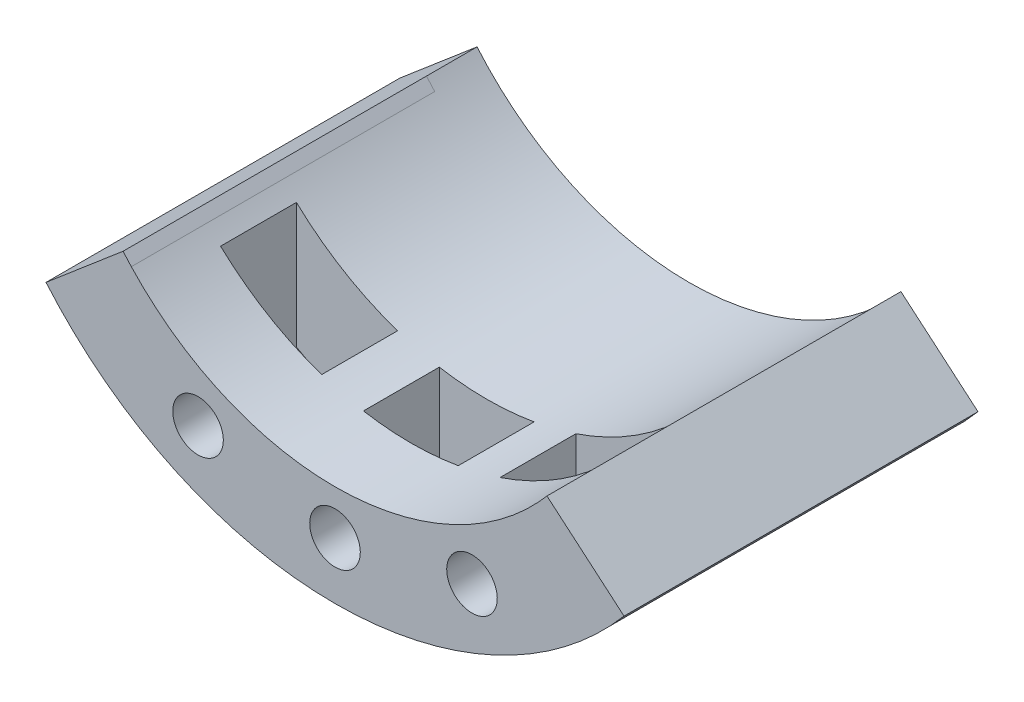
ISO-10303-21;
HEADER;
FILE_DESCRIPTION(('STEP AP214'),'2;1');
FILE_NAME('part.step','',(''),(''),'','','');
FILE_SCHEMA(('AUTOMOTIVE_DESIGN { 1 0 10303 214 1 1 1 1 }'));
ENDSEC;
DATA;
#1=APPLICATION_CONTEXT('core data for automotive mechanical design processes');
#2=APPLICATION_PROTOCOL_DEFINITION('international standard','automotive_design',2000,#1);
#3=PRODUCT_CONTEXT('',#1,'mechanical');
#4=PRODUCT('Part','Part','',(#3));
#5=PRODUCT_RELATED_PRODUCT_CATEGORY('part','',(#4));
#6=PRODUCT_DEFINITION_FORMATION('','',#4);
#7=PRODUCT_DEFINITION_CONTEXT('part definition',#1,'design');
#8=PRODUCT_DEFINITION('design','',#6,#7);
#9=PRODUCT_DEFINITION_SHAPE('','',#8);
#10=(LENGTH_UNIT() NAMED_UNIT(*) SI_UNIT(.MILLI.,.METRE.));
#11=(NAMED_UNIT(*) PLANE_ANGLE_UNIT() SI_UNIT($,.RADIAN.));
#12=(NAMED_UNIT(*) SI_UNIT($,.STERADIAN.) SOLID_ANGLE_UNIT());
#13=UNCERTAINTY_MEASURE_WITH_UNIT(LENGTH_MEASURE(1.E-05),#10,'distance_accuracy_value','');
#14=(GEOMETRIC_REPRESENTATION_CONTEXT(3) GLOBAL_UNCERTAINTY_ASSIGNED_CONTEXT((#13)) GLOBAL_UNIT_ASSIGNED_CONTEXT((#10,
#11,#12)) REPRESENTATION_CONTEXT('',''));
#15=CARTESIAN_POINT('',(0.,0.,0.));
#16=DIRECTION('',(0.,0.,1.));
#17=DIRECTION('',(1.,0.,0.));
#18=AXIS2_PLACEMENT_3D('',#15,#16,#17);
#19=CARTESIAN_POINT('',(98.2719431435022,-189.468770193744,4.));
#20=DIRECTION('',(0.,0.,-1.));
#21=DIRECTION('',(-1.,0.,0.));
#22=AXIS2_PLACEMENT_3D('',#19,#20,#21);
#23=CYLINDRICAL_SURFACE('',#22,30.);
#24=CARTESIAN_POINT('',(98.2719431435022,-189.468770193744,-6.00000000000001));
#25=DIRECTION('',(0.,0.,1.));
#26=DIRECTION('',(1.,0.,0.));
#27=AXIS2_PLACEMENT_3D('',#24,#25,#26);
#28=CIRCLE('',#27,30.);
#29=CARTESIAN_POINT('',(91.2193686715909,-218.628008752358,-6.00000000000001));
#30=VERTEX_POINT('',#29);
#31=CARTESIAN_POINT('',(83.2193686715909,-215.419107412508,-6.00000000000001));
#32=VERTEX_POINT('',#31);
#33=EDGE_CURVE('E262',#30,#32,#28,.F.);
#34=ORIENTED_EDGE('',*,*,#33,.F.);
#35=DIRECTION('',(0.,0.,-1.));
#36=VECTOR('',#35,1.);
#37=CARTESIAN_POINT('',(91.2193686715909,-218.628008752358,4.));
#38=LINE('',#37,#36);
#39=CARTESIAN_POINT('',(91.2193686715909,-218.628008752358,-12.));
#40=VERTEX_POINT('',#39);
#41=EDGE_CURVE('E230',#40,#30,#38,.F.);
#42=ORIENTED_EDGE('',*,*,#41,.F.);
#43=CARTESIAN_POINT('',(98.2719431435022,-189.468770193744,-12.));
#44=DIRECTION('',(0.,0.,-1.));
#45=DIRECTION('',(-1.,0.,0.));
#46=AXIS2_PLACEMENT_3D('',#43,#44,#45);
#47=CIRCLE('',#46,30.);
#48=CARTESIAN_POINT('',(83.2193686715909,-215.419107412508,-12.));
#49=VERTEX_POINT('',#48);
#50=EDGE_CURVE('E234',#49,#40,#47,.F.);
#51=ORIENTED_EDGE('',*,*,#50,.F.);
#52=DIRECTION('',(0.,0.,-1.));
#53=VECTOR('',#52,1.);
#54=CARTESIAN_POINT('',(83.2193686715909,-215.419107412508,4.));
#55=LINE('',#54,#53);
#56=EDGE_CURVE('E237',#32,#49,#55,.T.);
#57=ORIENTED_EDGE('',*,*,#56,.F.);
#58=EDGE_LOOP('',(#34,#42,#51,#57));
#59=FACE_BOUND('',#58,.T.);
#60=CARTESIAN_POINT('',(98.2719431435022,-189.468770193744,-6.00000000000001));
#61=DIRECTION('',(0.,0.,1.));
#62=DIRECTION('',(1.,0.,0.));
#63=AXIS2_PLACEMENT_3D('',#60,#61,#62);
#64=CIRCLE('',#63,30.);
#65=CARTESIAN_POINT('',(102.021943143502,-219.233472443221,-6.00000000000001));
#66=VERTEX_POINT('',#65);
#67=CARTESIAN_POINT('',(94.5219431435022,-219.233472443221,-6.00000000000001));
#68=VERTEX_POINT('',#67);
#69=EDGE_CURVE('E266',#66,#68,#64,.F.);
#70=ORIENTED_EDGE('',*,*,#69,.F.);
#71=DIRECTION('',(0.,0.,-1.));
#72=VECTOR('',#71,1.);
#73=CARTESIAN_POINT('',(102.021943143502,-219.233472443221,4.));
#74=LINE('',#73,#72);
#75=CARTESIAN_POINT('',(102.021943143502,-219.233472443221,-12.));
#76=VERTEX_POINT('',#75);
#77=EDGE_CURVE('E214',#76,#66,#74,.F.);
#78=ORIENTED_EDGE('',*,*,#77,.F.);
#79=CARTESIAN_POINT('',(98.2719431435022,-189.468770193744,-12.));
#80=DIRECTION('',(0.,0.,-1.));
#81=DIRECTION('',(-1.,0.,0.));
#82=AXIS2_PLACEMENT_3D('',#79,#80,#81);
#83=CIRCLE('',#82,30.);
#84=CARTESIAN_POINT('',(94.5219431435022,-219.233472443221,-12.));
#85=VERTEX_POINT('',#84);
#86=EDGE_CURVE('E224',#85,#76,#83,.F.);
#87=ORIENTED_EDGE('',*,*,#86,.F.);
#88=DIRECTION('',(0.,0.,-1.));
#89=VECTOR('',#88,1.);
#90=CARTESIAN_POINT('',(94.5219431435022,-219.233472443221,4.));
#91=LINE('',#90,#89);
#92=EDGE_CURVE('E227',#68,#85,#91,.T.);
#93=ORIENTED_EDGE('',*,*,#92,.F.);
#94=EDGE_LOOP('',(#70,#78,#87,#93));
#95=FACE_BOUND('',#94,.T.);
#96=CARTESIAN_POINT('',(98.2719431435022,-189.468770193744,-6.00000000000001));
#97=DIRECTION('',(0.,0.,-1.));
#98=DIRECTION('',(-1.,0.,0.));
#99=AXIS2_PLACEMENT_3D('',#96,#97,#98);
#100=CIRCLE('',#99,30.);
#101=CARTESIAN_POINT('',(105.324517615414,-218.628008752358,-6.00000000000001));
#102=VERTEX_POINT('',#101);
#103=CARTESIAN_POINT('',(113.324517615414,-215.419107412508,-6.00000000000001));
#104=VERTEX_POINT('',#103);
#105=EDGE_CURVE('E179',#102,#104,#100,.F.);
#106=ORIENTED_EDGE('',*,*,#105,.T.);
#107=DIRECTION('',(0.,0.,-1.));
#108=VECTOR('',#107,1.);
#109=CARTESIAN_POINT('',(113.324517615414,-215.419107412508,4.));
#110=LINE('',#109,#108);
#111=CARTESIAN_POINT('',(113.324517615414,-215.419107412508,-12.));
#112=VERTEX_POINT('',#111);
#113=EDGE_CURVE('E209',#112,#104,#110,.F.);
#114=ORIENTED_EDGE('',*,*,#113,.F.);
#115=CARTESIAN_POINT('',(98.2719431435022,-189.468770193744,-12.));
#116=DIRECTION('',(0.,0.,-1.));
#117=DIRECTION('',(-1.,0.,0.));
#118=AXIS2_PLACEMENT_3D('',#115,#116,#117);
#119=CIRCLE('',#118,30.);
#120=CARTESIAN_POINT('',(105.324517615414,-218.628008752358,-12.));
#121=VERTEX_POINT('',#120);
#122=EDGE_CURVE('E207',#121,#112,#119,.F.);
#123=ORIENTED_EDGE('',*,*,#122,.F.);
#124=DIRECTION('',(0.,0.,-1.));
#125=VECTOR('',#124,1.);
#126=CARTESIAN_POINT('',(105.324517615414,-218.628008752358,4.));
#127=LINE('',#126,#125);
#128=EDGE_CURVE('E198',#102,#121,#127,.T.);
#129=ORIENTED_EDGE('',*,*,#128,.F.);
#130=EDGE_LOOP('',(#106,#114,#123,#129));
#131=FACE_BOUND('',#130,.T.);
#132=DIRECTION('',(0.,0.,1.));
#133=VECTOR('',#132,1.);
#134=CARTESIAN_POINT('',(121.132806476772,-208.895064942295,-28.));
#135=LINE('',#134,#133);
#136=CARTESIAN_POINT('',(121.132806476772,-208.895064942295,-28.));
#137=VERTEX_POINT('',#136);
#138=CARTESIAN_POINT('',(121.132806476772,-208.895064942295,0.));
#139=VERTEX_POINT('',#138);
#140=EDGE_CURVE('E544',#137,#139,#135,.T.);
#141=ORIENTED_EDGE('',*,*,#140,.T.);
#142=CARTESIAN_POINT('',(98.2719431435022,-189.468770193744,0.));
#143=DIRECTION('',(0.,0.,1.));
#144=DIRECTION('',(0.,-1.,0.));
#145=AXIS2_PLACEMENT_3D('',#142,#143,#144);
#146=CIRCLE('',#145,30.);
#147=CARTESIAN_POINT('',(75.4110798102327,-208.895064942295,0.));
#148=VERTEX_POINT('',#147);
#149=EDGE_CURVE('E245',#139,#148,#146,.F.);
#150=ORIENTED_EDGE('',*,*,#149,.T.);
#151=DIRECTION('',(0.,0.,1.));
#152=VECTOR('',#151,1.);
#153=CARTESIAN_POINT('',(75.4110798102327,-208.895064942295,-28.));
#154=LINE('',#153,#152);
#155=CARTESIAN_POINT('',(75.4110798102327,-208.895064942295,-28.));
#156=VERTEX_POINT('',#155);
#157=EDGE_CURVE('E347',#156,#148,#154,.T.);
#158=ORIENTED_EDGE('',*,*,#157,.F.);
#159=CARTESIAN_POINT('',(98.2719431435022,-189.468770193744,-28.));
#160=DIRECTION('',(0.,0.,-1.));
#161=DIRECTION('',(-1.,0.,0.));
#162=AXIS2_PLACEMENT_3D('',#159,#160,#161);
#163=CIRCLE('',#162,30.);
#164=EDGE_CURVE('E333',#137,#156,#163,.T.);
#165=ORIENTED_EDGE('',*,*,#164,.F.);
#166=EDGE_LOOP('',(#141,#150,#158,#165));
#167=FACE_BOUND('',#166,.T.);
#168=ADVANCED_FACE('F46',(#59,#95,#131,#167),#23,.T.);
#169=CARTESIAN_POINT('',(98.2719431435022,-214.968770193744,4.));
#170=DIRECTION('',(0.,0.,-1.));
#171=DIRECTION('',(-1.,0.,0.));
#172=AXIS2_PLACEMENT_3D('',#169,#170,#171);
#173=CYLINDRICAL_SURFACE('',#172,2.);
#174=CARTESIAN_POINT('',(98.2719431435022,-214.968770193744,-6.00000000000001));
#175=DIRECTION('',(0.,0.,1.));
#176=DIRECTION('',(1.,0.,0.));
#177=AXIS2_PLACEMENT_3D('',#174,#175,#176);
#178=CIRCLE('',#177,2.);
#179=CARTESIAN_POINT('',(100.271943143502,-214.968770193744,-6.00000000000001));
#180=VERTEX_POINT('',#179);
#181=EDGE_CURVE('E192',#180,#180,#178,.T.);
#182=ORIENTED_EDGE('',*,*,#181,.F.);
#183=EDGE_LOOP('',(#182));
#184=FACE_BOUND('',#183,.T.);
#185=CARTESIAN_POINT('',(98.2719431435022,-214.968770193744,0.));
#186=DIRECTION('',(0.,0.,1.));
#187=DIRECTION('',(0.,-1.,0.));
#188=AXIS2_PLACEMENT_3D('',#185,#186,#187);
#189=CIRCLE('',#188,2.);
#190=CARTESIAN_POINT('',(98.2719431435022,-216.968770193744,0.));
#191=VERTEX_POINT('',#190);
#192=EDGE_CURVE('E258',#191,#191,#189,.F.);
#193=ORIENTED_EDGE('',*,*,#192,.F.);
#194=EDGE_LOOP('',(#193));
#195=FACE_BOUND('',#194,.T.);
#196=ADVANCED_FACE('F383',(#184,#195),#173,.F.);
#197=CARTESIAN_POINT('',(109.106818677426,-212.704235759103,4.));
#198=DIRECTION('',(0.,0.,-1.));
#199=DIRECTION('',(-1.,0.,0.));
#200=AXIS2_PLACEMENT_3D('',#197,#198,#199);
#201=CYLINDRICAL_SURFACE('',#200,2.);
#202=CARTESIAN_POINT('',(109.106818677426,-212.704235759103,-6.00000000000001));
#203=DIRECTION('',(0.,0.,1.));
#204=DIRECTION('',(1.,0.,0.));
#205=AXIS2_PLACEMENT_3D('',#202,#203,#204);
#206=CIRCLE('',#205,2.);
#207=CARTESIAN_POINT('',(111.106818677426,-212.704235759103,-6.00000000000001));
#208=VERTEX_POINT('',#207);
#209=EDGE_CURVE('E191',#208,#208,#206,.T.);
#210=ORIENTED_EDGE('',*,*,#209,.F.);
#211=EDGE_LOOP('',(#210));
#212=FACE_BOUND('',#211,.T.);
#213=CARTESIAN_POINT('',(109.106818677426,-212.704235759103,0.));
#214=DIRECTION('',(0.,0.,1.));
#215=DIRECTION('',(0.,-1.,0.));
#216=AXIS2_PLACEMENT_3D('',#213,#214,#215);
#217=CIRCLE('',#216,2.);
#218=CARTESIAN_POINT('',(109.106818677426,-214.704235759103,0.));
#219=VERTEX_POINT('',#218);
#220=EDGE_CURVE('E254',#219,#219,#217,.F.);
#221=ORIENTED_EDGE('',*,*,#220,.F.);
#222=EDGE_LOOP('',(#221));
#223=FACE_BOUND('',#222,.T.);
#224=ADVANCED_FACE('F378',(#212,#223),#201,.F.);
#225=CARTESIAN_POINT('',(87.4370676095787,-212.704235759103,4.));
#226=DIRECTION('',(0.,0.,-1.));
#227=DIRECTION('',(-1.,0.,0.));
#228=AXIS2_PLACEMENT_3D('',#225,#226,#227);
#229=CYLINDRICAL_SURFACE('',#228,2.);
#230=CARTESIAN_POINT('',(87.4370676095787,-212.704235759103,-6.00000000000001));
#231=DIRECTION('',(0.,0.,1.));
#232=DIRECTION('',(1.,0.,0.));
#233=AXIS2_PLACEMENT_3D('',#230,#231,#232);
#234=CIRCLE('',#233,2.);
#235=CARTESIAN_POINT('',(89.4370676095787,-212.704235759103,-6.00000000000001));
#236=VERTEX_POINT('',#235);
#237=EDGE_CURVE('E265',#236,#236,#234,.T.);
#238=ORIENTED_EDGE('',*,*,#237,.F.);
#239=EDGE_LOOP('',(#238));
#240=FACE_BOUND('',#239,.T.);
#241=CARTESIAN_POINT('',(87.4370676095787,-212.704235759103,0.));
#242=DIRECTION('',(0.,0.,1.));
#243=DIRECTION('',(0.,-1.,0.));
#244=AXIS2_PLACEMENT_3D('',#241,#242,#243);
#245=CIRCLE('',#244,2.);
#246=CARTESIAN_POINT('',(87.4370676095787,-214.704235759103,0.));
#247=VERTEX_POINT('',#246);
#248=EDGE_CURVE('E244',#247,#247,#245,.F.);
#249=ORIENTED_EDGE('',*,*,#248,.F.);
#250=EDGE_LOOP('',(#249));
#251=FACE_BOUND('',#250,.T.);
#252=ADVANCED_FACE('F382',(#240,#251),#229,.F.);
#253=CARTESIAN_POINT('',(81.5073100324379,-203.714719676015,-28.));
#254=DIRECTION('',(0.647543158285025,-0.762028777775653,0.));
#255=DIRECTION('',(0.762028777775653,0.647543158285025,0.));
#256=AXIS2_PLACEMENT_3D('',#253,#254,#255);
#257=PLANE('',#256);
#258=DIRECTION('',(-0.762028777775653,-0.647543158285025,0.));
#259=VECTOR('',#258,1.);
#260=CARTESIAN_POINT('',(81.5073100324379,-203.714719676015,0.));
#261=LINE('',#260,#259);
#262=CARTESIAN_POINT('',(81.5073100324379,-203.714719676015,0.));
#263=VERTEX_POINT('',#262);
#264=EDGE_CURVE('E240',#263,#148,#261,.T.);
#265=ORIENTED_EDGE('',*,*,#264,.F.);
#266=DIRECTION('',(0.,0.,1.));
#267=VECTOR('',#266,1.);
#268=CARTESIAN_POINT('',(81.5073100324379,-203.714719676015,-24.));
#269=LINE('',#268,#267);
#270=CARTESIAN_POINT('',(81.5073100324379,-203.714719676015,-24.));
#271=VERTEX_POINT('',#270);
#272=EDGE_CURVE('E330',#271,#263,#269,.T.);
#273=ORIENTED_EDGE('',*,*,#272,.F.);
#274=DIRECTION('',(0.,0.,1.));
#275=VECTOR('',#274,1.);
#276=CARTESIAN_POINT('',(81.5073100324379,-203.714719676015,-28.));
#277=LINE('',#276,#275);
#278=CARTESIAN_POINT('',(81.5073100324379,-203.714719676015,-28.));
#279=VERTEX_POINT('',#278);
#280=EDGE_CURVE('E338',#279,#271,#277,.T.);
#281=ORIENTED_EDGE('',*,*,#280,.F.);
#282=DIRECTION('',(0.762028777775653,0.647543158285026,0.));
#283=VECTOR('',#282,1.);
#284=CARTESIAN_POINT('',(81.5073100324379,-203.714719676015,-28.));
#285=LINE('',#284,#283);
#286=EDGE_CURVE('E69',#156,#279,#285,.T.);
#287=ORIENTED_EDGE('',*,*,#286,.F.);
#288=ORIENTED_EDGE('',*,*,#157,.T.);
#289=EDGE_LOOP('',(#265,#273,#281,#287,#288));
#290=FACE_BOUND('',#289,.T.);
#291=ADVANCED_FACE('F386',(#290),#257,.F.);
#292=CARTESIAN_POINT('',(115.036576254567,-203.714719676015,-28.));
#293=DIRECTION('',(-0.647543158285025,-0.762028777775653,0.));
#294=DIRECTION('',(0.762028777775653,-0.647543158285025,0.));
#295=AXIS2_PLACEMENT_3D('',#292,#293,#294);
#296=PLANE('',#295);
#297=DIRECTION('',(-0.762028777775653,0.647543158285025,0.));
#298=VECTOR('',#297,1.);
#299=CARTESIAN_POINT('',(115.036576254567,-203.714719676015,0.));
#300=LINE('',#299,#298);
#301=CARTESIAN_POINT('',(115.036576254567,-203.714719676015,0.));
#302=VERTEX_POINT('',#301);
#303=EDGE_CURVE('E241',#139,#302,#300,.T.);
#304=ORIENTED_EDGE('',*,*,#303,.F.);
#305=ORIENTED_EDGE('',*,*,#140,.F.);
#306=DIRECTION('',(0.762028777775653,-0.647543158285025,0.));
#307=VECTOR('',#306,1.);
#308=CARTESIAN_POINT('',(115.036576254567,-203.714719676015,-28.));
#309=LINE('',#308,#307);
#310=CARTESIAN_POINT('',(115.036576254567,-203.714719676015,-28.));
#311=VERTEX_POINT('',#310);
#312=EDGE_CURVE('E329',#311,#137,#309,.T.);
#313=ORIENTED_EDGE('',*,*,#312,.F.);
#314=DIRECTION('',(0.,0.,1.));
#315=VECTOR('',#314,1.);
#316=CARTESIAN_POINT('',(115.036576254567,-203.714719676015,-28.));
#317=LINE('',#316,#315);
#318=CARTESIAN_POINT('',(115.036576254567,-203.714719676015,-24.));
#319=VERTEX_POINT('',#318);
#320=EDGE_CURVE('E344',#311,#319,#317,.T.);
#321=ORIENTED_EDGE('',*,*,#320,.T.);
#322=DIRECTION('',(0.,0.,1.));
#323=VECTOR('',#322,1.);
#324=CARTESIAN_POINT('',(115.036576254567,-203.714719676015,-24.));
#325=LINE('',#324,#323);
#326=EDGE_CURVE('E61',#319,#302,#325,.T.);
#327=ORIENTED_EDGE('',*,*,#326,.T.);
#328=EDGE_LOOP('',(#304,#305,#313,#321,#327));
#329=FACE_BOUND('',#328,.T.);
#330=ADVANCED_FACE('F377',(#329),#296,.F.);
#331=CARTESIAN_POINT('',(98.2719431435022,-189.468770193744,-28.));
#332=DIRECTION('',(0.,0.,1.));
#333=DIRECTION('',(1.,0.,0.));
#334=AXIS2_PLACEMENT_3D('',#331,#332,#333);
#335=CYLINDRICAL_SURFACE('',#334,22.);
#336=CARTESIAN_POINT('',(98.2719431435022,-189.468770193744,0.));
#337=DIRECTION('',(0.,0.,1.));
#338=DIRECTION('',(-1.,0.,0.));
#339=AXIS2_PLACEMENT_3D('',#336,#337,#338);
#340=CIRCLE('',#339,22.);
#341=CARTESIAN_POINT('',(82.1599167850105,-204.448843845875,0.));
#342=VERTEX_POINT('',#341);
#343=CARTESIAN_POINT('',(114.383969501994,-204.448843845875,0.));
#344=VERTEX_POINT('',#343);
#345=EDGE_CURVE('E339',#342,#344,#340,.T.);
#346=ORIENTED_EDGE('',*,*,#345,.T.);
#347=DIRECTION('',(0.,0.,1.));
#348=VECTOR('',#347,1.);
#349=CARTESIAN_POINT('',(114.383969501994,-204.448843845875,-24.));
#350=LINE('',#349,#348);
#351=CARTESIAN_POINT('',(114.383969501994,-204.448843845875,-24.));
#352=VERTEX_POINT('',#351);
#353=EDGE_CURVE('E282',#352,#344,#350,.T.);
#354=ORIENTED_EDGE('',*,*,#353,.F.);
#355=CARTESIAN_POINT('',(98.2719431435022,-189.468770193744,-24.));
#356=DIRECTION('',(0.,0.,1.));
#357=DIRECTION('',(0.732364834476895,-0.680912438733227,0.));
#358=AXIS2_PLACEMENT_3D('',#355,#356,#357);
#359=CIRCLE('',#358,22.);
#360=EDGE_CURVE('E288',#352,#319,#359,.T.);
#361=ORIENTED_EDGE('',*,*,#360,.T.);
#362=ORIENTED_EDGE('',*,*,#320,.F.);
#363=CARTESIAN_POINT('',(98.2719431435022,-189.468770193744,-28.));
#364=DIRECTION('',(0.,0.,1.));
#365=DIRECTION('',(-1.,0.,0.));
#366=AXIS2_PLACEMENT_3D('',#363,#364,#365);
#367=CIRCLE('',#366,22.);
#368=EDGE_CURVE('E321',#279,#311,#367,.T.);
#369=ORIENTED_EDGE('',*,*,#368,.F.);
#370=ORIENTED_EDGE('',*,*,#280,.T.);
#371=CARTESIAN_POINT('',(82.1599167850105,-204.448843845875,-24.));
#372=DIRECTION('',(-0.66439337421086,0.747383063967005,0.));
#373=VECTOR('',#372,1.);
#374=LINE('',#371,#373);
#375=CARTESIAN_POINT('',(82.1599167850105,-204.448843845875,-24.));
#376=VERTEX_POINT('',#375);
#377=EDGE_CURVE('E343',#376,#271,#374,.T.);
#378=ORIENTED_EDGE('',*,*,#377,.F.);
#379=DIRECTION('',(0.,0.,1.));
#380=VECTOR('',#379,1.);
#381=CARTESIAN_POINT('',(82.1599167850105,-204.448843845875,-24.));
#382=LINE('',#381,#380);
#383=EDGE_CURVE('E286',#376,#342,#382,.T.);
#384=ORIENTED_EDGE('',*,*,#383,.T.);
#385=EDGE_LOOP('',(#346,#354,#361,#362,#369,#370,#378,#384));
#386=FACE_BOUND('',#385,.T.);
#387=DIRECTION('',(0.,0.,1.));
#388=VECTOR('',#387,1.);
#389=CARTESIAN_POINT('',(91.2193686715908,-210.307704747078,-28.));
#390=LINE('',#389,#388);
#391=CARTESIAN_POINT('',(91.2193686715908,-210.307704747078,-12.));
#392=VERTEX_POINT('',#391);
#393=CARTESIAN_POINT('',(91.2193686715908,-210.307704747078,-6.00000000000001));
#394=VERTEX_POINT('',#393);
#395=EDGE_CURVE('E491',#392,#394,#390,.T.);
#396=ORIENTED_EDGE('',*,*,#395,.T.);
#397=CARTESIAN_POINT('',(98.2719431435022,-189.468770193744,-6.00000000000001));
#398=DIRECTION('',(0.,0.,1.));
#399=DIRECTION('',(1.,0.,0.));
#400=AXIS2_PLACEMENT_3D('',#397,#398,#399);
#401=CIRCLE('',#400,22.);
#402=CARTESIAN_POINT('',(83.2193686715909,-205.513083883259,-6.00000000000001));
#403=VERTEX_POINT('',#402);
#404=EDGE_CURVE('E528',#394,#403,#401,.F.);
#405=ORIENTED_EDGE('',*,*,#404,.T.);
#406=DIRECTION('',(0.,0.,1.));
#407=VECTOR('',#406,1.);
#408=CARTESIAN_POINT('',(83.2193686715909,-205.513083883259,-28.));
#409=LINE('',#408,#407);
#410=CARTESIAN_POINT('',(83.2193686715909,-205.513083883259,-12.));
#411=VERTEX_POINT('',#410);
#412=EDGE_CURVE('E11',#403,#411,#409,.F.);
#413=ORIENTED_EDGE('',*,*,#412,.T.);
#414=CARTESIAN_POINT('',(98.2719431435022,-189.468770193744,-12.));
#415=DIRECTION('',(0.,0.,-1.));
#416=DIRECTION('',(-1.,0.,0.));
#417=AXIS2_PLACEMENT_3D('',#414,#415,#416);
#418=CIRCLE('',#417,22.);
#419=EDGE_CURVE('E54',#411,#392,#418,.F.);
#420=ORIENTED_EDGE('',*,*,#419,.T.);
#421=EDGE_LOOP('',(#396,#405,#413,#420));
#422=FACE_BOUND('',#421,.T.);
#423=DIRECTION('',(0.,0.,1.));
#424=VECTOR('',#423,1.);
#425=CARTESIAN_POINT('',(102.021943143502,-211.146812079486,-28.));
#426=LINE('',#425,#424);
#427=CARTESIAN_POINT('',(102.021943143502,-211.146812079486,-12.));
#428=VERTEX_POINT('',#427);
#429=CARTESIAN_POINT('',(102.021943143502,-211.146812079486,-6.00000000000001));
#430=VERTEX_POINT('',#429);
#431=EDGE_CURVE('E450',#428,#430,#426,.T.);
#432=ORIENTED_EDGE('',*,*,#431,.T.);
#433=CARTESIAN_POINT('',(98.2719431435022,-189.468770193744,-6.00000000000001));
#434=DIRECTION('',(0.,0.,1.));
#435=DIRECTION('',(1.,0.,0.));
#436=AXIS2_PLACEMENT_3D('',#433,#434,#435);
#437=CIRCLE('',#436,22.);
#438=CARTESIAN_POINT('',(94.5219431435023,-211.146812079486,-6.00000000000001));
#439=VERTEX_POINT('',#438);
#440=EDGE_CURVE('E480',#430,#439,#437,.F.);
#441=ORIENTED_EDGE('',*,*,#440,.T.);
#442=DIRECTION('',(0.,0.,1.));
#443=VECTOR('',#442,1.);
#444=CARTESIAN_POINT('',(94.5219431435023,-211.146812079486,-28.));
#445=LINE('',#444,#443);
#446=CARTESIAN_POINT('',(94.5219431435023,-211.146812079486,-12.));
#447=VERTEX_POINT('',#446);
#448=EDGE_CURVE('E435',#439,#447,#445,.F.);
#449=ORIENTED_EDGE('',*,*,#448,.T.);
#450=CARTESIAN_POINT('',(98.2719431435022,-189.468770193744,-12.));
#451=DIRECTION('',(0.,0.,-1.));
#452=DIRECTION('',(-1.,0.,0.));
#453=AXIS2_PLACEMENT_3D('',#450,#451,#452);
#454=CIRCLE('',#453,22.);
#455=EDGE_CURVE('E488',#447,#428,#454,.F.);
#456=ORIENTED_EDGE('',*,*,#455,.T.);
#457=EDGE_LOOP('',(#432,#441,#449,#456));
#458=FACE_BOUND('',#457,.T.);
#459=DIRECTION('',(0.,0.,1.));
#460=VECTOR('',#459,1.);
#461=CARTESIAN_POINT('',(113.324517615414,-205.513083883259,-28.));
#462=LINE('',#461,#460);
#463=CARTESIAN_POINT('',(113.324517615414,-205.513083883259,-12.));
#464=VERTEX_POINT('',#463);
#465=CARTESIAN_POINT('',(113.324517615414,-205.513083883259,-6.00000000000001));
#466=VERTEX_POINT('',#465);
#467=EDGE_CURVE('E473',#464,#466,#462,.T.);
#468=ORIENTED_EDGE('',*,*,#467,.T.);
#469=CARTESIAN_POINT('',(98.2719431435022,-189.468770193744,-6.00000000000001));
#470=DIRECTION('',(0.,0.,-1.));
#471=DIRECTION('',(-1.,0.,0.));
#472=AXIS2_PLACEMENT_3D('',#469,#470,#471);
#473=CIRCLE('',#472,22.);
#474=CARTESIAN_POINT('',(105.324517615414,-210.307704747078,-6.00000000000001));
#475=VERTEX_POINT('',#474);
#476=EDGE_CURVE('E475',#475,#466,#473,.F.);
#477=ORIENTED_EDGE('',*,*,#476,.F.);
#478=DIRECTION('',(0.,0.,1.));
#479=VECTOR('',#478,1.);
#480=CARTESIAN_POINT('',(105.324517615414,-210.307704747078,-28.));
#481=LINE('',#480,#479);
#482=CARTESIAN_POINT('',(105.324517615414,-210.307704747078,-12.));
#483=VERTEX_POINT('',#482);
#484=EDGE_CURVE('E201',#475,#483,#481,.F.);
#485=ORIENTED_EDGE('',*,*,#484,.T.);
#486=CARTESIAN_POINT('',(98.2719431435022,-189.468770193744,-12.));
#487=DIRECTION('',(0.,0.,-1.));
#488=DIRECTION('',(-1.,0.,0.));
#489=AXIS2_PLACEMENT_3D('',#486,#487,#488);
#490=CIRCLE('',#489,22.);
#491=EDGE_CURVE('E470',#483,#464,#490,.F.);
#492=ORIENTED_EDGE('',*,*,#491,.T.);
#493=EDGE_LOOP('',(#468,#477,#485,#492));
#494=FACE_BOUND('',#493,.T.);
#495=ADVANCED_FACE('F367',(#386,#422,#458,#494),#335,.F.);
#496=CARTESIAN_POINT('',(98.2719431435022,-189.468770193744,-28.));
#497=DIRECTION('',(0.,0.,-1.));
#498=DIRECTION('',(-1.,0.,0.));
#499=AXIS2_PLACEMENT_3D('',#496,#497,#498);
#500=PLANE('',#499);
#501=ORIENTED_EDGE('',*,*,#368,.T.);
#502=ORIENTED_EDGE('',*,*,#312,.T.);
#503=ORIENTED_EDGE('',*,*,#164,.T.);
#504=ORIENTED_EDGE('',*,*,#286,.T.);
#505=EDGE_LOOP('',(#501,#502,#503,#504));
#506=FACE_BOUND('',#505,.T.);
#507=ADVANCED_FACE('F312',(#506),#500,.T.);
#508=CARTESIAN_POINT('',(81.5073100324379,-203.714719676015,-24.));
#509=DIRECTION('',(0.747383063967008,0.664393374210856,0.));
#510=DIRECTION('',(-0.664393374210856,0.747383063967008,0.));
#511=AXIS2_PLACEMENT_3D('',#508,#509,#510);
#512=PLANE('',#511);
#513=DIRECTION('',(-0.664393374210856,0.747383063967008,0.));
#514=VECTOR('',#513,1.);
#515=CARTESIAN_POINT('',(81.5073100324379,-203.714719676015,0.));
#516=LINE('',#515,#514);
#517=EDGE_CURVE('E530',#342,#263,#516,.T.);
#518=ORIENTED_EDGE('',*,*,#517,.F.);
#519=ORIENTED_EDGE('',*,*,#383,.F.);
#520=ORIENTED_EDGE('',*,*,#377,.T.);
#521=ORIENTED_EDGE('',*,*,#272,.T.);
#522=EDGE_LOOP('',(#518,#519,#520,#521));
#523=FACE_BOUND('',#522,.T.);
#524=ADVANCED_FACE('F307',(#523),#512,.T.);
#525=CARTESIAN_POINT('',(115.036576254567,-203.714719676015,-24.));
#526=DIRECTION('',(-0.747383063967008,0.664393374210856,0.));
#527=DIRECTION('',(-0.664393374210856,-0.747383063967008,0.));
#528=AXIS2_PLACEMENT_3D('',#525,#526,#527);
#529=PLANE('',#528);
#530=DIRECTION('',(-0.664393374210856,-0.747383063967008,0.));
#531=VECTOR('',#530,1.);
#532=CARTESIAN_POINT('',(115.036576254567,-203.714719676015,0.));
#533=LINE('',#532,#531);
#534=EDGE_CURVE('E534',#302,#344,#533,.T.);
#535=ORIENTED_EDGE('',*,*,#534,.F.);
#536=ORIENTED_EDGE('',*,*,#326,.F.);
#537=ORIENTED_EDGE('',*,*,#360,.F.);
#538=ORIENTED_EDGE('',*,*,#353,.T.);
#539=EDGE_LOOP('',(#535,#536,#537,#538));
#540=FACE_BOUND('',#539,.T.);
#541=ADVANCED_FACE('F296',(#540),#529,.T.);
#542=CARTESIAN_POINT('',(98.2719431435023,-224.468770193744,-6.00000000000001));
#543=DIRECTION('',(0.,0.,1.));
#544=DIRECTION('',(1.,0.,0.));
#545=AXIS2_PLACEMENT_3D('',#542,#543,#544);
#546=PLANE('',#545);
#547=ORIENTED_EDGE('',*,*,#237,.T.);
#548=EDGE_LOOP('',(#547));
#549=FACE_BOUND('',#548,.T.);
#550=ORIENTED_EDGE('',*,*,#33,.T.);
#551=DIRECTION('',(0.,1.,0.));
#552=VECTOR('',#551,1.);
#553=CARTESIAN_POINT('',(83.2193686715909,-229.468770193744,-6.00000000000001));
#554=LINE('',#553,#552);
#555=EDGE_CURVE('E217',#32,#403,#554,.T.);
#556=ORIENTED_EDGE('',*,*,#555,.T.);
#557=ORIENTED_EDGE('',*,*,#404,.F.);
#558=DIRECTION('',(0.,1.,0.));
#559=VECTOR('',#558,1.);
#560=CARTESIAN_POINT('',(91.2193686715908,-229.468770193744,-6.00000000000001));
#561=LINE('',#560,#559);
#562=EDGE_CURVE('E437',#30,#394,#561,.T.);
#563=ORIENTED_EDGE('',*,*,#562,.F.);
#564=EDGE_LOOP('',(#550,#556,#557,#563));
#565=FACE_BOUND('',#564,.T.);
#566=ADVANCED_FACE('F306',(#549,#565),#546,.F.);
#567=CARTESIAN_POINT('',(98.2719431435023,-224.468770193744,-6.00000000000001));
#568=DIRECTION('',(0.,0.,1.));
#569=DIRECTION('',(1.,0.,0.));
#570=AXIS2_PLACEMENT_3D('',#567,#568,#569);
#571=PLANE('',#570);
#572=ORIENTED_EDGE('',*,*,#181,.T.);
#573=EDGE_LOOP('',(#572));
#574=FACE_BOUND('',#573,.T.);
#575=ORIENTED_EDGE('',*,*,#69,.T.);
#576=DIRECTION('',(0.,1.,0.));
#577=VECTOR('',#576,1.);
#578=CARTESIAN_POINT('',(94.5219431435022,-229.468770193744,-6.00000000000001));
#579=LINE('',#578,#577);
#580=EDGE_CURVE('E423',#68,#439,#579,.T.);
#581=ORIENTED_EDGE('',*,*,#580,.T.);
#582=ORIENTED_EDGE('',*,*,#440,.F.);
#583=DIRECTION('',(0.,1.,0.));
#584=VECTOR('',#583,1.);
#585=CARTESIAN_POINT('',(102.021943143502,-229.468770193744,-6.00000000000001));
#586=LINE('',#585,#584);
#587=EDGE_CURVE('E425',#66,#430,#586,.T.);
#588=ORIENTED_EDGE('',*,*,#587,.F.);
#589=EDGE_LOOP('',(#575,#581,#582,#588));
#590=FACE_BOUND('',#589,.T.);
#591=ADVANCED_FACE('F409',(#574,#590),#571,.F.);
#592=CARTESIAN_POINT('',(98.2719431435023,-224.468770193744,-6.00000000000001));
#593=DIRECTION('',(0.,0.,-1.));
#594=DIRECTION('',(-1.,0.,0.));
#595=AXIS2_PLACEMENT_3D('',#592,#593,#594);
#596=PLANE('',#595);
#597=ORIENTED_EDGE('',*,*,#105,.F.);
#598=DIRECTION('',(0.,1.,0.));
#599=VECTOR('',#598,1.);
#600=CARTESIAN_POINT('',(105.324517615414,-229.468770193744,-6.00000000000001));
#601=LINE('',#600,#599);
#602=EDGE_CURVE('E183',#102,#475,#601,.T.);
#603=ORIENTED_EDGE('',*,*,#602,.T.);
#604=ORIENTED_EDGE('',*,*,#476,.T.);
#605=DIRECTION('',(0.,1.,0.));
#606=VECTOR('',#605,1.);
#607=CARTESIAN_POINT('',(113.324517615414,-229.468770193744,-6.00000000000001));
#608=LINE('',#607,#606);
#609=EDGE_CURVE('E185',#104,#466,#608,.T.);
#610=ORIENTED_EDGE('',*,*,#609,.F.);
#611=EDGE_LOOP('',(#597,#603,#604,#610));
#612=FACE_BOUND('',#611,.T.);
#613=ORIENTED_EDGE('',*,*,#209,.T.);
#614=EDGE_LOOP('',(#613));
#615=FACE_BOUND('',#614,.T.);
#616=ADVANCED_FACE('F181',(#612,#615),#596,.T.);
#617=CARTESIAN_POINT('',(134.271943143502,-169.468770193744,0.));
#618=DIRECTION('',(0.,0.,1.));
#619=DIRECTION('',(0.,-1.,0.));
#620=AXIS2_PLACEMENT_3D('',#617,#618,#619);
#621=PLANE('',#620);
#622=ORIENTED_EDGE('',*,*,#303,.T.);
#623=ORIENTED_EDGE('',*,*,#534,.T.);
#624=ORIENTED_EDGE('',*,*,#345,.F.);
#625=ORIENTED_EDGE('',*,*,#517,.T.);
#626=ORIENTED_EDGE('',*,*,#264,.T.);
#627=ORIENTED_EDGE('',*,*,#149,.F.);
#628=EDGE_LOOP('',(#622,#623,#624,#625,#626,#627));
#629=FACE_BOUND('',#628,.T.);
#630=ORIENTED_EDGE('',*,*,#248,.T.);
#631=EDGE_LOOP('',(#630));
#632=FACE_BOUND('',#631,.T.);
#633=ORIENTED_EDGE('',*,*,#220,.T.);
#634=EDGE_LOOP('',(#633));
#635=FACE_BOUND('',#634,.T.);
#636=ORIENTED_EDGE('',*,*,#192,.T.);
#637=EDGE_LOOP('',(#636));
#638=FACE_BOUND('',#637,.T.);
#639=ADVANCED_FACE('F398',(#629,#632,#635,#638),#621,.T.);
#640=CARTESIAN_POINT('',(113.324517615414,-229.468770193744,-12.));
#641=DIRECTION('',(1.,0.,0.));
#642=DIRECTION('',(0.,0.,-1.));
#643=AXIS2_PLACEMENT_3D('',#640,#641,#642);
#644=PLANE('',#643);
#645=ORIENTED_EDGE('',*,*,#113,.T.);
#646=ORIENTED_EDGE('',*,*,#609,.T.);
#647=ORIENTED_EDGE('',*,*,#467,.F.);
#648=DIRECTION('',(0.,1.,0.));
#649=VECTOR('',#648,1.);
#650=CARTESIAN_POINT('',(113.324517615414,-229.468770193744,-12.));
#651=LINE('',#650,#649);
#652=EDGE_CURVE('E462',#112,#464,#651,.T.);
#653=ORIENTED_EDGE('',*,*,#652,.F.);
#654=EDGE_LOOP('',(#645,#646,#647,#653));
#655=FACE_BOUND('',#654,.T.);
#656=ADVANCED_FACE('F400',(#655),#644,.F.);
#657=CARTESIAN_POINT('',(105.324517615414,-229.468770193744,-12.));
#658=DIRECTION('',(-1.,0.,0.));
#659=DIRECTION('',(0.,0.,1.));
#660=AXIS2_PLACEMENT_3D('',#657,#658,#659);
#661=PLANE('',#660);
#662=ORIENTED_EDGE('',*,*,#128,.T.);
#663=DIRECTION('',(0.,1.,0.));
#664=VECTOR('',#663,1.);
#665=CARTESIAN_POINT('',(105.324517615414,-229.468770193744,-12.));
#666=LINE('',#665,#664);
#667=EDGE_CURVE('E203',#121,#483,#666,.T.);
#668=ORIENTED_EDGE('',*,*,#667,.T.);
#669=ORIENTED_EDGE('',*,*,#484,.F.);
#670=ORIENTED_EDGE('',*,*,#602,.F.);
#671=EDGE_LOOP('',(#662,#668,#669,#670));
#672=FACE_BOUND('',#671,.T.);
#673=ADVANCED_FACE('F196',(#672),#661,.F.);
#674=CARTESIAN_POINT('',(105.824517615414,-229.468770193744,-12.));
#675=DIRECTION('',(0.,0.,-1.));
#676=DIRECTION('',(-1.,0.,0.));
#677=AXIS2_PLACEMENT_3D('',#674,#675,#676);
#678=PLANE('',#677);
#679=ORIENTED_EDGE('',*,*,#122,.T.);
#680=ORIENTED_EDGE('',*,*,#652,.T.);
#681=ORIENTED_EDGE('',*,*,#491,.F.);
#682=ORIENTED_EDGE('',*,*,#667,.F.);
#683=EDGE_LOOP('',(#679,#680,#681,#682));
#684=FACE_BOUND('',#683,.T.);
#685=ADVANCED_FACE('F469',(#684),#678,.F.);
#686=CARTESIAN_POINT('',(94.5219431435022,-229.468770193744,-12.));
#687=DIRECTION('',(-1.,0.,0.));
#688=DIRECTION('',(0.,0.,1.));
#689=AXIS2_PLACEMENT_3D('',#686,#687,#688);
#690=PLANE('',#689);
#691=ORIENTED_EDGE('',*,*,#92,.T.);
#692=DIRECTION('',(0.,1.,0.));
#693=VECTOR('',#692,1.);
#694=CARTESIAN_POINT('',(94.5219431435022,-229.468770193744,-12.));
#695=LINE('',#694,#693);
#696=EDGE_CURVE('E438',#85,#447,#695,.T.);
#697=ORIENTED_EDGE('',*,*,#696,.T.);
#698=ORIENTED_EDGE('',*,*,#448,.F.);
#699=ORIENTED_EDGE('',*,*,#580,.F.);
#700=EDGE_LOOP('',(#691,#697,#698,#699));
#701=FACE_BOUND('',#700,.T.);
#702=ADVANCED_FACE('F431',(#701),#690,.F.);
#703=CARTESIAN_POINT('',(102.021943143502,-229.468770193744,-12.));
#704=DIRECTION('',(0.,0.,-1.));
#705=DIRECTION('',(-1.,0.,0.));
#706=AXIS2_PLACEMENT_3D('',#703,#704,#705);
#707=PLANE('',#706);
#708=ORIENTED_EDGE('',*,*,#86,.T.);
#709=DIRECTION('',(0.,1.,0.));
#710=VECTOR('',#709,1.);
#711=CARTESIAN_POINT('',(102.021943143502,-229.468770193744,-12.));
#712=LINE('',#711,#710);
#713=EDGE_CURVE('E445',#76,#428,#712,.T.);
#714=ORIENTED_EDGE('',*,*,#713,.T.);
#715=ORIENTED_EDGE('',*,*,#455,.F.);
#716=ORIENTED_EDGE('',*,*,#696,.F.);
#717=EDGE_LOOP('',(#708,#714,#715,#716));
#718=FACE_BOUND('',#717,.T.);
#719=ADVANCED_FACE('F444',(#718),#707,.F.);
#720=CARTESIAN_POINT('',(102.021943143502,-229.468770193744,-6.00000000000001));
#721=DIRECTION('',(1.,0.,0.));
#722=DIRECTION('',(0.,0.,-1.));
#723=AXIS2_PLACEMENT_3D('',#720,#721,#722);
#724=PLANE('',#723);
#725=ORIENTED_EDGE('',*,*,#77,.T.);
#726=ORIENTED_EDGE('',*,*,#587,.T.);
#727=ORIENTED_EDGE('',*,*,#431,.F.);
#728=ORIENTED_EDGE('',*,*,#713,.F.);
#729=EDGE_LOOP('',(#725,#726,#727,#728));
#730=FACE_BOUND('',#729,.T.);
#731=ADVANCED_FACE('F448',(#730),#724,.F.);
#732=CARTESIAN_POINT('',(83.2193686715909,-229.468770193744,-12.));
#733=DIRECTION('',(-1.,0.,0.));
#734=DIRECTION('',(0.,0.,1.));
#735=AXIS2_PLACEMENT_3D('',#732,#733,#734);
#736=PLANE('',#735);
#737=ORIENTED_EDGE('',*,*,#56,.T.);
#738=DIRECTION('',(0.,1.,0.));
#739=VECTOR('',#738,1.);
#740=CARTESIAN_POINT('',(83.2193686715909,-229.468770193744,-12.));
#741=LINE('',#740,#739);
#742=EDGE_CURVE('E504',#49,#411,#741,.T.);
#743=ORIENTED_EDGE('',*,*,#742,.T.);
#744=ORIENTED_EDGE('',*,*,#412,.F.);
#745=ORIENTED_EDGE('',*,*,#555,.F.);
#746=EDGE_LOOP('',(#737,#743,#744,#745));
#747=FACE_BOUND('',#746,.T.);
#748=ADVANCED_FACE('F509',(#747),#736,.F.);
#749=CARTESIAN_POINT('',(83.7193686715909,-229.468770193744,-12.));
#750=DIRECTION('',(0.,0.,-1.));
#751=DIRECTION('',(-1.,0.,0.));
#752=AXIS2_PLACEMENT_3D('',#749,#750,#751);
#753=PLANE('',#752);
#754=ORIENTED_EDGE('',*,*,#50,.T.);
#755=DIRECTION('',(0.,1.,0.));
#756=VECTOR('',#755,1.);
#757=CARTESIAN_POINT('',(91.2193686715908,-229.468770193744,-12.));
#758=LINE('',#757,#756);
#759=EDGE_CURVE('E507',#40,#392,#758,.T.);
#760=ORIENTED_EDGE('',*,*,#759,.T.);
#761=ORIENTED_EDGE('',*,*,#419,.F.);
#762=ORIENTED_EDGE('',*,*,#742,.F.);
#763=EDGE_LOOP('',(#754,#760,#761,#762));
#764=FACE_BOUND('',#763,.T.);
#765=ADVANCED_FACE('F503',(#764),#753,.F.);
#766=CARTESIAN_POINT('',(91.2193686715908,-229.468770193744,-12.));
#767=DIRECTION('',(1.,0.,0.));
#768=DIRECTION('',(0.,0.,-1.));
#769=AXIS2_PLACEMENT_3D('',#766,#767,#768);
#770=PLANE('',#769);
#771=ORIENTED_EDGE('',*,*,#41,.T.);
#772=ORIENTED_EDGE('',*,*,#562,.T.);
#773=ORIENTED_EDGE('',*,*,#395,.F.);
#774=ORIENTED_EDGE('',*,*,#759,.F.);
#775=EDGE_LOOP('',(#771,#772,#773,#774));
#776=FACE_BOUND('',#775,.T.);
#777=ADVANCED_FACE('F525',(#776),#770,.F.);
#778=CLOSED_SHELL('',(#168,#196,#224,#252,#291,#330,#495,#507,#524,#541,#566,#591,#616,#639,
#656,#673,#685,#702,#719,#731,#748,#765,#777));
#779=MANIFOLD_SOLID_BREP('B2',#778);
#780=ADVANCED_BREP_SHAPE_REPRESENTATION('',(#18,#779),#14);
#781=SHAPE_DEFINITION_REPRESENTATION(#9,#780);
ENDSEC;
END-ISO-10303-21;
